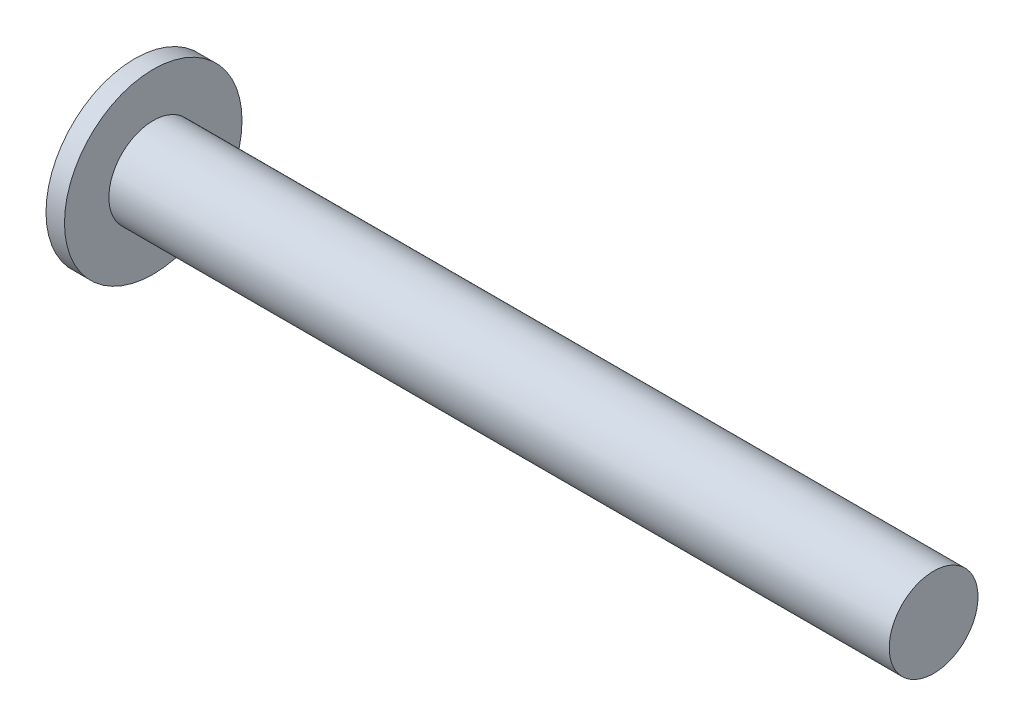
ISO-10303-21;
HEADER;
FILE_DESCRIPTION(('STEP AP214'),'2;1');
FILE_NAME('part.step','',(''),(''),'','','');
FILE_SCHEMA(('AUTOMOTIVE_DESIGN { 1 0 10303 214 1 1 1 1 }'));
ENDSEC;
DATA;
#1=APPLICATION_CONTEXT('core data for automotive mechanical design processes');
#2=APPLICATION_PROTOCOL_DEFINITION('international standard','automotive_design',2000,#1);
#3=PRODUCT_CONTEXT('',#1,'mechanical');
#4=PRODUCT('Part','Part','',(#3));
#5=PRODUCT_RELATED_PRODUCT_CATEGORY('part','',(#4));
#6=PRODUCT_DEFINITION_FORMATION('','',#4);
#7=PRODUCT_DEFINITION_CONTEXT('part definition',#1,'design');
#8=PRODUCT_DEFINITION('design','',#6,#7);
#9=PRODUCT_DEFINITION_SHAPE('','',#8);
#10=(LENGTH_UNIT() NAMED_UNIT(*) SI_UNIT(.MILLI.,.METRE.));
#11=(NAMED_UNIT(*) PLANE_ANGLE_UNIT() SI_UNIT($,.RADIAN.));
#12=(NAMED_UNIT(*) SI_UNIT($,.STERADIAN.) SOLID_ANGLE_UNIT());
#13=UNCERTAINTY_MEASURE_WITH_UNIT(LENGTH_MEASURE(1.E-05),#10,'distance_accuracy_value','');
#14=(GEOMETRIC_REPRESENTATION_CONTEXT(3) GLOBAL_UNCERTAINTY_ASSIGNED_CONTEXT((#13)) GLOBAL_UNIT_ASSIGNED_CONTEXT((#10,
#11,#12)) REPRESENTATION_CONTEXT('',''));
#15=CARTESIAN_POINT('',(0.,0.,0.));
#16=DIRECTION('',(0.,0.,1.));
#17=DIRECTION('',(1.,0.,0.));
#18=AXIS2_PLACEMENT_3D('',#15,#16,#17);
#19=CARTESIAN_POINT('',(2.49999999999995,0.,0.));
#20=DIRECTION('',(-1.,0.,0.));
#21=DIRECTION('',(0.,0.,1.));
#22=AXIS2_PLACEMENT_3D('',#19,#20,#21);
#23=CYLINDRICAL_SURFACE('',#22,12.);
#24=CARTESIAN_POINT('',(2.49999999999995,0.,0.));
#25=DIRECTION('',(1.,0.,0.));
#26=DIRECTION('',(0.,0.,-1.));
#27=AXIS2_PLACEMENT_3D('',#24,#25,#26);
#28=CIRCLE('',#27,12.);
#29=CARTESIAN_POINT('',(2.49999999999995,0.,-12.));
#30=VERTEX_POINT('',#29);
#31=EDGE_CURVE('E12',#30,#30,#28,.T.);
#32=ORIENTED_EDGE('',*,*,#31,.F.);
#33=EDGE_LOOP('',(#32));
#34=FACE_BOUND('',#33,.T.);
#35=CARTESIAN_POINT('',(0.,0.,0.));
#36=DIRECTION('',(1.,0.,0.));
#37=DIRECTION('',(0.,0.,-1.));
#38=AXIS2_PLACEMENT_3D('',#35,#36,#37);
#39=CIRCLE('',#38,12.);
#40=CARTESIAN_POINT('',(0.,0.,-12.));
#41=VERTEX_POINT('',#40);
#42=EDGE_CURVE('E49',#41,#41,#39,.T.);
#43=ORIENTED_EDGE('',*,*,#42,.T.);
#44=EDGE_LOOP('',(#43));
#45=FACE_BOUND('',#44,.T.);
#46=ADVANCED_FACE('F46',(#34,#45),#23,.T.);
#47=CARTESIAN_POINT('',(2.49999999999995,0.,0.));
#48=DIRECTION('',(1.,0.,0.));
#49=DIRECTION('',(0.,0.,-1.));
#50=AXIS2_PLACEMENT_3D('',#47,#48,#49);
#51=PLANE('',#50);
#52=CARTESIAN_POINT('',(2.49999999999995,0.,0.));
#53=DIRECTION('',(1.,0.,0.));
#54=DIRECTION('',(0.,0.,-1.));
#55=AXIS2_PLACEMENT_3D('',#52,#53,#54);
#56=CIRCLE('',#55,6.);
#57=CARTESIAN_POINT('',(2.49999999999995,0.,-6.));
#58=VERTEX_POINT('',#57);
#59=EDGE_CURVE('E58',#58,#58,#56,.T.);
#60=ORIENTED_EDGE('',*,*,#59,.F.);
#61=EDGE_LOOP('',(#60));
#62=FACE_BOUND('',#61,.T.);
#63=ORIENTED_EDGE('',*,*,#31,.T.);
#64=EDGE_LOOP('',(#63));
#65=FACE_BOUND('',#64,.T.);
#66=ADVANCED_FACE('F73',(#62,#65),#51,.T.);
#67=CARTESIAN_POINT('',(0.,0.,0.));
#68=DIRECTION('',(1.,0.,0.));
#69=DIRECTION('',(0.,0.,-1.));
#70=AXIS2_PLACEMENT_3D('',#67,#68,#69);
#71=PLANE('',#70);
#72=ORIENTED_EDGE('',*,*,#42,.F.);
#73=EDGE_LOOP('',(#72));
#74=FACE_BOUND('',#73,.T.);
#75=ADVANCED_FACE('F69',(#74),#71,.F.);
#76=CARTESIAN_POINT('',(108.,0.,1.11022302462516E-13));
#77=DIRECTION('',(-1.,0.,0.));
#78=DIRECTION('',(0.,0.,1.));
#79=AXIS2_PLACEMENT_3D('',#76,#77,#78);
#80=CYLINDRICAL_SURFACE('',#79,6.);
#81=CARTESIAN_POINT('',(108.,0.,1.11022302462516E-13));
#82=DIRECTION('',(1.,0.,0.));
#83=DIRECTION('',(0.,0.,-1.));
#84=AXIS2_PLACEMENT_3D('',#81,#82,#83);
#85=CIRCLE('',#84,6.);
#86=CARTESIAN_POINT('',(108.,0.,-5.99999999999989));
#87=VERTEX_POINT('',#86);
#88=EDGE_CURVE('E56',#87,#87,#85,.T.);
#89=ORIENTED_EDGE('',*,*,#88,.F.);
#90=EDGE_LOOP('',(#89));
#91=FACE_BOUND('',#90,.T.);
#92=ORIENTED_EDGE('',*,*,#59,.T.);
#93=EDGE_LOOP('',(#92));
#94=FACE_BOUND('',#93,.T.);
#95=ADVANCED_FACE('F66',(#91,#94),#80,.T.);
#96=CARTESIAN_POINT('',(108.,0.,1.11022302462516E-13));
#97=DIRECTION('',(1.,0.,0.));
#98=DIRECTION('',(0.,0.,-1.));
#99=AXIS2_PLACEMENT_3D('',#96,#97,#98);
#100=PLANE('',#99);
#101=ORIENTED_EDGE('',*,*,#88,.T.);
#102=EDGE_LOOP('',(#101));
#103=FACE_BOUND('',#102,.T.);
#104=ADVANCED_FACE('F64',(#103),#100,.T.);
#105=CLOSED_SHELL('',(#46,#66,#75,#95,#104));
#106=MANIFOLD_SOLID_BREP('B2',#105);
#107=ADVANCED_BREP_SHAPE_REPRESENTATION('',(#18,#106),#14);
#108=SHAPE_DEFINITION_REPRESENTATION(#9,#107);
ENDSEC;
END-ISO-10303-21;
